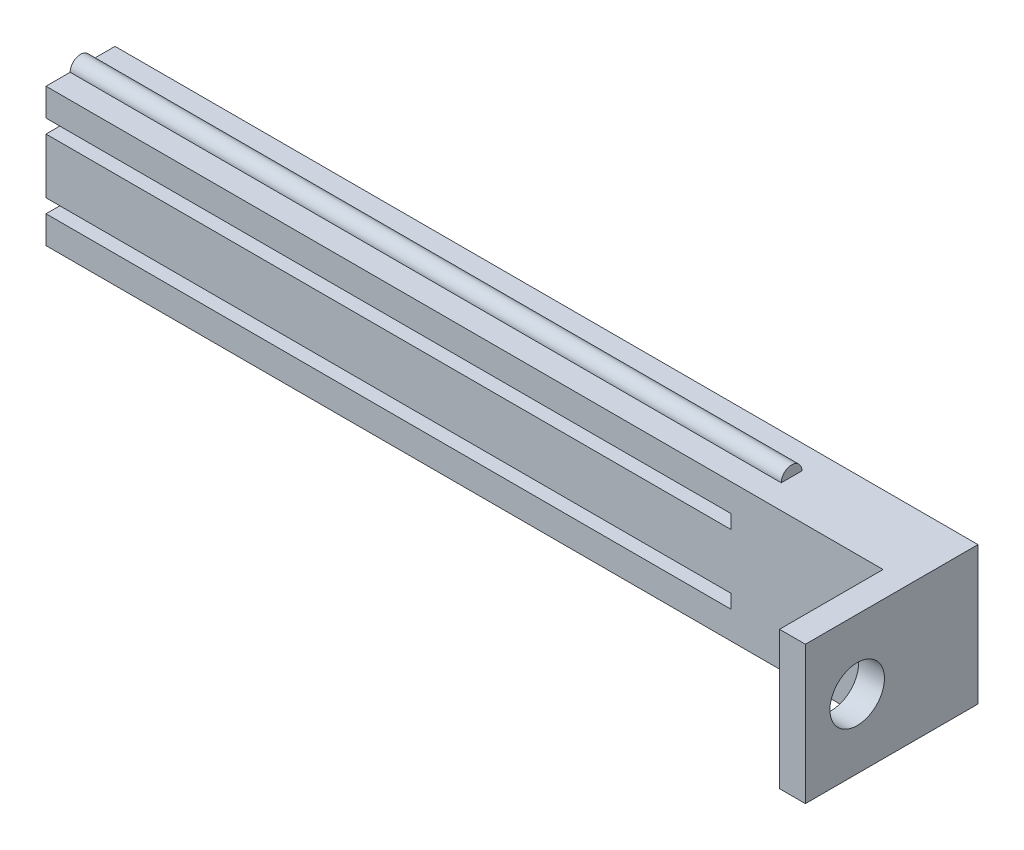
ISO-10303-21;
HEADER;
FILE_DESCRIPTION(('STEP AP214'),'2;1');
FILE_NAME('part.step','',(''),(''),'','','');
FILE_SCHEMA(('AUTOMOTIVE_DESIGN { 1 0 10303 214 1 1 1 1 }'));
ENDSEC;
DATA;
#1=APPLICATION_CONTEXT('core data for automotive mechanical design processes');
#2=APPLICATION_PROTOCOL_DEFINITION('international standard','automotive_design',2000,#1);
#3=PRODUCT_CONTEXT('',#1,'mechanical');
#4=PRODUCT('Part','Part','',(#3));
#5=PRODUCT_RELATED_PRODUCT_CATEGORY('part','',(#4));
#6=PRODUCT_DEFINITION_FORMATION('','',#4);
#7=PRODUCT_DEFINITION_CONTEXT('part definition',#1,'design');
#8=PRODUCT_DEFINITION('design','',#6,#7);
#9=PRODUCT_DEFINITION_SHAPE('','',#8);
#10=(LENGTH_UNIT() NAMED_UNIT(*) SI_UNIT(.MILLI.,.METRE.));
#11=(NAMED_UNIT(*) PLANE_ANGLE_UNIT() SI_UNIT($,.RADIAN.));
#12=(NAMED_UNIT(*) SI_UNIT($,.STERADIAN.) SOLID_ANGLE_UNIT());
#13=UNCERTAINTY_MEASURE_WITH_UNIT(LENGTH_MEASURE(1.E-05),#10,'distance_accuracy_value','');
#14=(GEOMETRIC_REPRESENTATION_CONTEXT(3) GLOBAL_UNCERTAINTY_ASSIGNED_CONTEXT((#13)) GLOBAL_UNIT_ASSIGNED_CONTEXT((#10,
#11,#12)) REPRESENTATION_CONTEXT('',''));
#15=CARTESIAN_POINT('',(0.,0.,0.));
#16=DIRECTION('',(0.,0.,1.));
#17=DIRECTION('',(1.,0.,0.));
#18=AXIS2_PLACEMENT_3D('',#15,#16,#17);
#19=CARTESIAN_POINT('',(-147.278734849391,68.6666666666667,20.));
#20=DIRECTION('',(1.,0.,0.));
#21=DIRECTION('',(0.,0.,-1.));
#22=AXIS2_PLACEMENT_3D('',#19,#20,#21);
#23=PLANE('',#22);
#24=DIRECTION('',(0.,-1.,0.));
#25=VECTOR('',#24,1.);
#26=CARTESIAN_POINT('',(-147.278734849391,0.,15.));
#27=LINE('',#26,#25);
#28=CARTESIAN_POINT('',(-147.278734849391,63.6666666666666,15.));
#29=VERTEX_POINT('',#28);
#30=CARTESIAN_POINT('',(-147.278734849391,60.6666666666666,15.));
#31=VERTEX_POINT('',#30);
#32=EDGE_CURVE('E241',#29,#31,#27,.T.);
#33=ORIENTED_EDGE('',*,*,#32,.T.);
#34=DIRECTION('',(0.,0.,-1.));
#35=VECTOR('',#34,1.);
#36=CARTESIAN_POINT('',(-147.278734849391,60.6666666666666,0.));
#37=LINE('',#36,#35);
#38=CARTESIAN_POINT('',(-147.278734849391,60.6666666666666,20.));
#39=VERTEX_POINT('',#38);
#40=EDGE_CURVE('E250',#39,#31,#37,.T.);
#41=ORIENTED_EDGE('',*,*,#40,.F.);
#42=DIRECTION('',(0.,-1.,0.));
#43=VECTOR('',#42,1.);
#44=CARTESIAN_POINT('',(-147.278734849391,68.6666666666667,20.));
#45=LINE('',#44,#43);
#46=CARTESIAN_POINT('',(-147.278734849391,68.6666666666667,20.));
#47=VERTEX_POINT('',#46);
#48=EDGE_CURVE('E463',#47,#39,#45,.T.);
#49=ORIENTED_EDGE('',*,*,#48,.F.);
#50=DIRECTION('',(0.,0.,-1.));
#51=VECTOR('',#50,1.);
#52=CARTESIAN_POINT('',(-147.278734849391,68.6666666666667,20.));
#53=LINE('',#52,#51);
#54=CARTESIAN_POINT('',(-147.278734849391,68.6666666666666,13.));
#55=VERTEX_POINT('',#54);
#56=EDGE_CURVE('E489',#47,#55,#53,.T.);
#57=ORIENTED_EDGE('',*,*,#56,.T.);
#58=CARTESIAN_POINT('',(-147.278734849391,68.6666666666666,10.));
#59=DIRECTION('',(-1.,0.,0.));
#60=DIRECTION('',(0.,-1.,0.));
#61=AXIS2_PLACEMENT_3D('',#58,#59,#60);
#62=CIRCLE('',#61,3.);
#63=CARTESIAN_POINT('',(-147.278734849391,68.6666666666667,7.));
#64=VERTEX_POINT('',#63);
#65=EDGE_CURVE('E408',#55,#64,#62,.T.);
#66=ORIENTED_EDGE('',*,*,#65,.T.);
#67=CARTESIAN_POINT('',(-147.278734849391,68.6666666666667,0.));
#68=VERTEX_POINT('',#67);
#69=EDGE_CURVE('E475',#64,#68,#53,.T.);
#70=ORIENTED_EDGE('',*,*,#69,.T.);
#71=DIRECTION('',(0.,-1.,0.));
#72=VECTOR('',#71,1.);
#73=CARTESIAN_POINT('',(-147.278734849391,68.6666666666667,0.));
#74=LINE('',#73,#72);
#75=CARTESIAN_POINT('',(-147.278734849391,28.6666666666667,0.));
#76=VERTEX_POINT('',#75);
#77=EDGE_CURVE('E462',#68,#76,#74,.T.);
#78=ORIENTED_EDGE('',*,*,#77,.T.);
#79=DIRECTION('',(0.,0.,-1.));
#80=VECTOR('',#79,1.);
#81=CARTESIAN_POINT('',(-147.278734849391,28.6666666666667,20.));
#82=LINE('',#81,#80);
#83=CARTESIAN_POINT('',(-147.278734849391,28.6666666666666,7.));
#84=VERTEX_POINT('',#83);
#85=EDGE_CURVE('E59',#84,#76,#82,.T.);
#86=ORIENTED_EDGE('',*,*,#85,.F.);
#87=CARTESIAN_POINT('',(-147.278734849391,28.6666666666666,10.));
#88=DIRECTION('',(-1.,0.,0.));
#89=DIRECTION('',(0.,-1.,0.));
#90=AXIS2_PLACEMENT_3D('',#87,#88,#89);
#91=CIRCLE('',#90,3.);
#92=CARTESIAN_POINT('',(-147.278734849391,28.6666666666667,13.));
#93=VERTEX_POINT('',#92);
#94=EDGE_CURVE('E411',#84,#93,#91,.T.);
#95=ORIENTED_EDGE('',*,*,#94,.T.);
#96=CARTESIAN_POINT('',(-147.278734849391,28.6666666666667,20.));
#97=VERTEX_POINT('',#96);
#98=EDGE_CURVE('E11',#97,#93,#82,.T.);
#99=ORIENTED_EDGE('',*,*,#98,.F.);
#100=CARTESIAN_POINT('',(-147.278734849391,36.6666666666666,20.));
#101=VERTEX_POINT('',#100);
#102=EDGE_CURVE('E469',#101,#97,#45,.T.);
#103=ORIENTED_EDGE('',*,*,#102,.F.);
#104=DIRECTION('',(0.,0.,-1.));
#105=VECTOR('',#104,1.);
#106=CARTESIAN_POINT('',(-147.278734849391,36.6666666666666,0.));
#107=LINE('',#106,#105);
#108=CARTESIAN_POINT('',(-147.278734849391,36.6666666666666,15.));
#109=VERTEX_POINT('',#108);
#110=EDGE_CURVE('E353',#101,#109,#107,.T.);
#111=ORIENTED_EDGE('',*,*,#110,.T.);
#112=DIRECTION('',(0.,-1.,0.));
#113=VECTOR('',#112,1.);
#114=CARTESIAN_POINT('',(-147.278734849391,0.,15.));
#115=LINE('',#114,#113);
#116=CARTESIAN_POINT('',(-147.278734849391,33.6666666666666,15.));
#117=VERTEX_POINT('',#116);
#118=EDGE_CURVE('E349',#109,#117,#115,.T.);
#119=ORIENTED_EDGE('',*,*,#118,.T.);
#120=DIRECTION('',(0.,0.,1.));
#121=VECTOR('',#120,1.);
#122=CARTESIAN_POINT('',(-147.278734849391,33.6666666666666,0.));
#123=LINE('',#122,#121);
#124=CARTESIAN_POINT('',(-147.278734849391,33.6666666666666,10.));
#125=VERTEX_POINT('',#124);
#126=EDGE_CURVE('E324',#125,#117,#123,.T.);
#127=ORIENTED_EDGE('',*,*,#126,.F.);
#128=DIRECTION('',(0.,-1.,0.));
#129=VECTOR('',#128,1.);
#130=CARTESIAN_POINT('',(-147.278734849391,0.,10.));
#131=LINE('',#130,#129);
#132=CARTESIAN_POINT('',(-147.278734849391,43.6666666666666,10.));
#133=VERTEX_POINT('',#132);
#134=EDGE_CURVE('E370',#133,#125,#131,.T.);
#135=ORIENTED_EDGE('',*,*,#134,.F.);
#136=DIRECTION('',(0.,0.,1.));
#137=VECTOR('',#136,1.);
#138=CARTESIAN_POINT('',(-147.278734849391,43.6666666666666,0.));
#139=LINE('',#138,#137);
#140=CARTESIAN_POINT('',(-147.278734849391,43.6666666666666,15.));
#141=VERTEX_POINT('',#140);
#142=EDGE_CURVE('E366',#133,#141,#139,.T.);
#143=ORIENTED_EDGE('',*,*,#142,.T.);
#144=DIRECTION('',(0.,-1.,0.));
#145=VECTOR('',#144,1.);
#146=CARTESIAN_POINT('',(-147.278734849391,0.,15.));
#147=LINE('',#146,#145);
#148=CARTESIAN_POINT('',(-147.278734849391,40.6666666666666,15.));
#149=VERTEX_POINT('',#148);
#150=EDGE_CURVE('E362',#141,#149,#147,.T.);
#151=ORIENTED_EDGE('',*,*,#150,.T.);
#152=DIRECTION('',(0.,0.,-1.));
#153=VECTOR('',#152,1.);
#154=CARTESIAN_POINT('',(-147.278734849391,40.6666666666666,0.));
#155=LINE('',#154,#153);
#156=CARTESIAN_POINT('',(-147.278734849391,40.6666666666666,20.));
#157=VERTEX_POINT('',#156);
#158=EDGE_CURVE('E358',#157,#149,#155,.T.);
#159=ORIENTED_EDGE('',*,*,#158,.F.);
#160=CARTESIAN_POINT('',(-147.278734849391,56.6666666666666,20.));
#161=VERTEX_POINT('',#160);
#162=EDGE_CURVE('E468',#161,#157,#45,.T.);
#163=ORIENTED_EDGE('',*,*,#162,.F.);
#164=DIRECTION('',(0.,0.,-1.));
#165=VECTOR('',#164,1.);
#166=CARTESIAN_POINT('',(-147.278734849391,56.6666666666666,0.));
#167=LINE('',#166,#165);
#168=CARTESIAN_POINT('',(-147.278734849391,56.6666666666666,15.));
#169=VERTEX_POINT('',#168);
#170=EDGE_CURVE('E256',#161,#169,#167,.T.);
#171=ORIENTED_EDGE('',*,*,#170,.T.);
#172=DIRECTION('',(0.,-1.,0.));
#173=VECTOR('',#172,1.);
#174=CARTESIAN_POINT('',(-147.278734849391,0.,15.));
#175=LINE('',#174,#173);
#176=CARTESIAN_POINT('',(-147.278734849391,53.6666666666666,15.));
#177=VERTEX_POINT('',#176);
#178=EDGE_CURVE('E292',#169,#177,#175,.T.);
#179=ORIENTED_EDGE('',*,*,#178,.T.);
#180=DIRECTION('',(0.,0.,1.));
#181=VECTOR('',#180,1.);
#182=CARTESIAN_POINT('',(-147.278734849391,53.6666666666666,0.));
#183=LINE('',#182,#181);
#184=CARTESIAN_POINT('',(-147.278734849391,53.6666666666666,10.));
#185=VERTEX_POINT('',#184);
#186=EDGE_CURVE('E288',#185,#177,#183,.T.);
#187=ORIENTED_EDGE('',*,*,#186,.F.);
#188=DIRECTION('',(0.,-1.,0.));
#189=VECTOR('',#188,1.);
#190=CARTESIAN_POINT('',(-147.278734849391,0.,10.));
#191=LINE('',#190,#189);
#192=CARTESIAN_POINT('',(-147.278734849391,63.6666666666666,10.));
#193=VERTEX_POINT('',#192);
#194=EDGE_CURVE('E284',#193,#185,#191,.T.);
#195=ORIENTED_EDGE('',*,*,#194,.F.);
#196=DIRECTION('',(0.,0.,1.));
#197=VECTOR('',#196,1.);
#198=CARTESIAN_POINT('',(-147.278734849391,63.6666666666666,0.));
#199=LINE('',#198,#197);
#200=EDGE_CURVE('E280',#193,#29,#199,.T.);
#201=ORIENTED_EDGE('',*,*,#200,.T.);
#202=EDGE_LOOP('',(#33,#41,#49,#57,#66,#70,#78,#86,#95,#99,#103,#111,#119,#127,#135,#143,#151,
#159,#163,#171,#179,#187,#195,#201));
#203=FACE_BOUND('',#202,.T.);
#204=ADVANCED_FACE('F51',(#203),#23,.F.);
#205=CARTESIAN_POINT('',(-147.278734849391,28.6666666666667,20.));
#206=DIRECTION('',(0.,1.,0.));
#207=DIRECTION('',(0.,0.,1.));
#208=AXIS2_PLACEMENT_3D('',#205,#206,#207);
#209=PLANE('',#208);
#210=DIRECTION('',(0.,0.,-1.));
#211=VECTOR('',#210,1.);
#212=CARTESIAN_POINT('',(58.7212651506094,28.6666666666665,7.));
#213=LINE('',#212,#211);
#214=CARTESIAN_POINT('',(58.7212651506094,28.6666666666667,13.));
#215=VERTEX_POINT('',#214);
#216=CARTESIAN_POINT('',(58.7212651506094,28.6666666666667,7.));
#217=VERTEX_POINT('',#216);
#218=EDGE_CURVE('E422',#215,#217,#213,.T.);
#219=ORIENTED_EDGE('',*,*,#218,.T.);
#220=DIRECTION('',(-1.,0.,0.));
#221=VECTOR('',#220,1.);
#222=CARTESIAN_POINT('',(58.7212651506094,28.6666666666665,7.));
#223=LINE('',#222,#221);
#224=EDGE_CURVE('E429',#217,#84,#223,.T.);
#225=ORIENTED_EDGE('',*,*,#224,.T.);
#226=ORIENTED_EDGE('',*,*,#85,.T.);
#227=DIRECTION('',(1.,0.,0.));
#228=VECTOR('',#227,1.);
#229=CARTESIAN_POINT('',(-147.278734849391,28.6666666666667,0.));
#230=LINE('',#229,#228);
#231=CARTESIAN_POINT('',(102.721265150609,28.6666666666667,0.));
#232=VERTEX_POINT('',#231);
#233=EDGE_CURVE('E479',#76,#232,#230,.T.);
#234=ORIENTED_EDGE('',*,*,#233,.T.);
#235=DIRECTION('',(0.,0.,-1.));
#236=VECTOR('',#235,1.);
#237=CARTESIAN_POINT('',(102.721265150609,28.6666666666667,20.));
#238=LINE('',#237,#236);
#239=CARTESIAN_POINT('',(102.721265150609,28.6666666666667,50.));
#240=VERTEX_POINT('',#239);
#241=EDGE_CURVE('E495',#240,#232,#238,.T.);
#242=ORIENTED_EDGE('',*,*,#241,.F.);
#243=DIRECTION('',(1.,0.,0.));
#244=VECTOR('',#243,1.);
#245=CARTESIAN_POINT('',(102.721265150609,28.6666666666667,50.));
#246=LINE('',#245,#244);
#247=CARTESIAN_POINT('',(95.2212651506094,28.6666666666667,50.));
#248=VERTEX_POINT('',#247);
#249=EDGE_CURVE('E447',#248,#240,#246,.T.);
#250=ORIENTED_EDGE('',*,*,#249,.F.);
#251=DIRECTION('',(0.,0.,-1.));
#252=VECTOR('',#251,1.);
#253=CARTESIAN_POINT('',(95.2212651506094,28.6666666666667,50.));
#254=LINE('',#253,#252);
#255=CARTESIAN_POINT('',(95.2212651506094,28.6666666666667,20.));
#256=VERTEX_POINT('',#255);
#257=EDGE_CURVE('E451',#248,#256,#254,.T.);
#258=ORIENTED_EDGE('',*,*,#257,.T.);
#259=DIRECTION('',(1.,0.,0.));
#260=VECTOR('',#259,1.);
#261=CARTESIAN_POINT('',(-147.278734849391,28.6666666666667,20.));
#262=LINE('',#261,#260);
#263=EDGE_CURVE('E467',#97,#256,#262,.T.);
#264=ORIENTED_EDGE('',*,*,#263,.F.);
#265=ORIENTED_EDGE('',*,*,#98,.T.);
#266=DIRECTION('',(-1.,0.,0.));
#267=VECTOR('',#266,1.);
#268=CARTESIAN_POINT('',(58.7212651506094,28.6666666666665,13.));
#269=LINE('',#268,#267);
#270=EDGE_CURVE('E425',#215,#93,#269,.T.);
#271=ORIENTED_EDGE('',*,*,#270,.F.);
#272=EDGE_LOOP('',(#219,#225,#226,#234,#242,#250,#258,#264,#265,#271));
#273=FACE_BOUND('',#272,.T.);
#274=ADVANCED_FACE('F506',(#273),#209,.F.);
#275=CARTESIAN_POINT('',(102.721265150609,68.6666666666667,20.));
#276=DIRECTION('',(-1.,0.,0.));
#277=DIRECTION('',(0.,-1.,0.));
#278=AXIS2_PLACEMENT_3D('',#275,#276,#277);
#279=PLANE('',#278);
#280=CARTESIAN_POINT('',(102.721265150609,48.6666666666666,35.));
#281=DIRECTION('',(-1.,0.,0.));
#282=DIRECTION('',(0.,-1.,0.));
#283=AXIS2_PLACEMENT_3D('',#280,#281,#282);
#284=CIRCLE('',#283,7.9);
#285=CARTESIAN_POINT('',(102.721265150609,40.7666666666666,35.));
#286=VERTEX_POINT('',#285);
#287=EDGE_CURVE('E354',#286,#286,#284,.T.);
#288=ORIENTED_EDGE('',*,*,#287,.T.);
#289=EDGE_LOOP('',(#288));
#290=FACE_BOUND('',#289,.T.);
#291=DIRECTION('',(0.,1.,0.));
#292=VECTOR('',#291,1.);
#293=CARTESIAN_POINT('',(102.721265150609,68.6666666666667,0.));
#294=LINE('',#293,#292);
#295=CARTESIAN_POINT('',(102.721265150609,68.6666666666667,0.));
#296=VERTEX_POINT('',#295);
#297=EDGE_CURVE('E482',#232,#296,#294,.T.);
#298=ORIENTED_EDGE('',*,*,#297,.T.);
#299=DIRECTION('',(0.,0.,-1.));
#300=VECTOR('',#299,1.);
#301=CARTESIAN_POINT('',(102.721265150609,68.6666666666667,20.));
#302=LINE('',#301,#300);
#303=CARTESIAN_POINT('',(102.721265150609,68.6666666666667,50.));
#304=VERTEX_POINT('',#303);
#305=EDGE_CURVE('E492',#304,#296,#302,.T.);
#306=ORIENTED_EDGE('',*,*,#305,.F.);
#307=DIRECTION('',(0.,1.,0.));
#308=VECTOR('',#307,1.);
#309=CARTESIAN_POINT('',(102.721265150609,68.6666666666667,50.));
#310=LINE('',#309,#308);
#311=EDGE_CURVE('E437',#240,#304,#310,.T.);
#312=ORIENTED_EDGE('',*,*,#311,.F.);
#313=ORIENTED_EDGE('',*,*,#241,.T.);
#314=EDGE_LOOP('',(#298,#306,#312,#313));
#315=FACE_BOUND('',#314,.T.);
#316=ADVANCED_FACE('F521',(#290,#315),#279,.F.);
#317=CARTESIAN_POINT('',(-147.278734849391,68.6666666666667,20.));
#318=DIRECTION('',(0.,-1.,0.));
#319=DIRECTION('',(0.,0.,-1.));
#320=AXIS2_PLACEMENT_3D('',#317,#318,#319);
#321=PLANE('',#320);
#322=DIRECTION('',(0.,0.,1.));
#323=VECTOR('',#322,1.);
#324=CARTESIAN_POINT('',(58.7212651506094,68.6666666666665,7.));
#325=LINE('',#324,#323);
#326=CARTESIAN_POINT('',(58.7212651506094,68.6666666666665,7.));
#327=VERTEX_POINT('',#326);
#328=CARTESIAN_POINT('',(58.7212651506094,68.6666666666665,13.));
#329=VERTEX_POINT('',#328);
#330=EDGE_CURVE('E404',#327,#329,#325,.T.);
#331=ORIENTED_EDGE('',*,*,#330,.T.);
#332=DIRECTION('',(-1.,0.,0.));
#333=VECTOR('',#332,1.);
#334=CARTESIAN_POINT('',(58.7212651506094,68.6666666666665,13.));
#335=LINE('',#334,#333);
#336=EDGE_CURVE('E302',#329,#55,#335,.T.);
#337=ORIENTED_EDGE('',*,*,#336,.T.);
#338=ORIENTED_EDGE('',*,*,#56,.F.);
#339=DIRECTION('',(-1.,0.,0.));
#340=VECTOR('',#339,1.);
#341=CARTESIAN_POINT('',(-147.278734849391,68.6666666666667,20.));
#342=LINE('',#341,#340);
#343=CARTESIAN_POINT('',(95.2212651506094,68.6666666666667,20.));
#344=VERTEX_POINT('',#343);
#345=EDGE_CURVE('E472',#344,#47,#342,.T.);
#346=ORIENTED_EDGE('',*,*,#345,.F.);
#347=DIRECTION('',(0.,0.,-1.));
#348=VECTOR('',#347,1.);
#349=CARTESIAN_POINT('',(95.2212651506094,68.6666666666667,50.));
#350=LINE('',#349,#348);
#351=CARTESIAN_POINT('',(95.2212651506094,68.6666666666667,50.));
#352=VERTEX_POINT('',#351);
#353=EDGE_CURVE('E458',#352,#344,#350,.T.);
#354=ORIENTED_EDGE('',*,*,#353,.F.);
#355=DIRECTION('',(-1.,0.,0.));
#356=VECTOR('',#355,1.);
#357=CARTESIAN_POINT('',(102.721265150609,68.6666666666667,50.));
#358=LINE('',#357,#356);
#359=EDGE_CURVE('E441',#304,#352,#358,.T.);
#360=ORIENTED_EDGE('',*,*,#359,.F.);
#361=ORIENTED_EDGE('',*,*,#305,.T.);
#362=DIRECTION('',(-1.,0.,0.));
#363=VECTOR('',#362,1.);
#364=CARTESIAN_POINT('',(-147.278734849391,68.6666666666667,0.));
#365=LINE('',#364,#363);
#366=EDGE_CURVE('E485',#296,#68,#365,.T.);
#367=ORIENTED_EDGE('',*,*,#366,.T.);
#368=ORIENTED_EDGE('',*,*,#69,.F.);
#369=DIRECTION('',(-1.,0.,0.));
#370=VECTOR('',#369,1.);
#371=CARTESIAN_POINT('',(58.7212651506094,68.6666666666665,7.));
#372=LINE('',#371,#370);
#373=EDGE_CURVE('E400',#327,#64,#372,.T.);
#374=ORIENTED_EDGE('',*,*,#373,.F.);
#375=EDGE_LOOP('',(#331,#337,#338,#346,#354,#360,#361,#367,#368,#374));
#376=FACE_BOUND('',#375,.T.);
#377=ADVANCED_FACE('F518',(#376),#321,.F.);
#378=CARTESIAN_POINT('',(0.,0.,20.));
#379=DIRECTION('',(0.,0.,1.));
#380=DIRECTION('',(1.,0.,0.));
#381=AXIS2_PLACEMENT_3D('',#378,#379,#380);
#382=PLANE('',#381);
#383=DIRECTION('',(-1.,0.,0.));
#384=VECTOR('',#383,1.);
#385=CARTESIAN_POINT('',(51.2212651506094,60.6666666666665,20.));
#386=LINE('',#385,#384);
#387=CARTESIAN_POINT('',(51.2212651506094,60.6666666666665,20.));
#388=VERTEX_POINT('',#387);
#389=EDGE_CURVE('E303',#388,#39,#386,.T.);
#390=ORIENTED_EDGE('',*,*,#389,.F.);
#391=DIRECTION('',(0.,1.,0.));
#392=VECTOR('',#391,1.);
#393=CARTESIAN_POINT('',(51.2212651506094,0.,20.));
#394=LINE('',#393,#392);
#395=CARTESIAN_POINT('',(51.2212651506094,56.6666666666665,20.));
#396=VERTEX_POINT('',#395);
#397=EDGE_CURVE('E273',#396,#388,#394,.T.);
#398=ORIENTED_EDGE('',*,*,#397,.F.);
#399=DIRECTION('',(-1.,0.,0.));
#400=VECTOR('',#399,1.);
#401=CARTESIAN_POINT('',(51.2212651506094,56.6666666666665,20.));
#402=LINE('',#401,#400);
#403=EDGE_CURVE('E306',#396,#161,#402,.T.);
#404=ORIENTED_EDGE('',*,*,#403,.T.);
#405=ORIENTED_EDGE('',*,*,#162,.T.);
#406=DIRECTION('',(-1.,0.,0.));
#407=VECTOR('',#406,1.);
#408=CARTESIAN_POINT('',(51.2212651506094,40.6666666666665,20.));
#409=LINE('',#408,#407);
#410=CARTESIAN_POINT('',(51.2212651506094,40.6666666666665,20.));
#411=VERTEX_POINT('',#410);
#412=EDGE_CURVE('E391',#411,#157,#409,.T.);
#413=ORIENTED_EDGE('',*,*,#412,.F.);
#414=DIRECTION('',(0.,1.,0.));
#415=VECTOR('',#414,1.);
#416=CARTESIAN_POINT('',(51.2212651506094,0.,20.));
#417=LINE('',#416,#415);
#418=CARTESIAN_POINT('',(51.2212651506094,36.6666666666665,20.));
#419=VERTEX_POINT('',#418);
#420=EDGE_CURVE('E327',#419,#411,#417,.T.);
#421=ORIENTED_EDGE('',*,*,#420,.F.);
#422=DIRECTION('',(-1.,0.,0.));
#423=VECTOR('',#422,1.);
#424=CARTESIAN_POINT('',(51.2212651506094,36.6666666666665,20.));
#425=LINE('',#424,#423);
#426=EDGE_CURVE('E394',#419,#101,#425,.T.);
#427=ORIENTED_EDGE('',*,*,#426,.T.);
#428=ORIENTED_EDGE('',*,*,#102,.T.);
#429=ORIENTED_EDGE('',*,*,#263,.T.);
#430=DIRECTION('',(0.,-1.,0.));
#431=VECTOR('',#430,1.);
#432=CARTESIAN_POINT('',(95.2212651506094,68.6666666666667,20.));
#433=LINE('',#432,#431);
#434=EDGE_CURVE('E433',#344,#256,#433,.T.);
#435=ORIENTED_EDGE('',*,*,#434,.F.);
#436=ORIENTED_EDGE('',*,*,#345,.T.);
#437=ORIENTED_EDGE('',*,*,#48,.T.);
#438=EDGE_LOOP('',(#390,#398,#404,#405,#413,#421,#427,#428,#429,#435,#436,#437));
#439=FACE_BOUND('',#438,.T.);
#440=ADVANCED_FACE('F534',(#439),#382,.T.);
#441=CARTESIAN_POINT('',(0.,0.,0.));
#442=DIRECTION('',(0.,0.,1.));
#443=DIRECTION('',(1.,0.,0.));
#444=AXIS2_PLACEMENT_3D('',#441,#442,#443);
#445=PLANE('',#444);
#446=ORIENTED_EDGE('',*,*,#77,.F.);
#447=ORIENTED_EDGE('',*,*,#366,.F.);
#448=ORIENTED_EDGE('',*,*,#297,.F.);
#449=ORIENTED_EDGE('',*,*,#233,.F.);
#450=EDGE_LOOP('',(#446,#447,#448,#449));
#451=FACE_BOUND('',#450,.T.);
#452=ADVANCED_FACE('F512',(#451),#445,.F.);
#453=CARTESIAN_POINT('',(95.2212651506094,68.6666666666667,50.));
#454=DIRECTION('',(1.,0.,0.));
#455=DIRECTION('',(0.,0.,-1.));
#456=AXIS2_PLACEMENT_3D('',#453,#454,#455);
#457=PLANE('',#456);
#458=CARTESIAN_POINT('',(95.2212651506094,48.6666666666666,35.));
#459=DIRECTION('',(-1.,0.,0.));
#460=DIRECTION('',(0.,-1.,0.));
#461=AXIS2_PLACEMENT_3D('',#458,#459,#460);
#462=CIRCLE('',#461,7.9);
#463=CARTESIAN_POINT('',(95.2212651506094,40.7666666666666,35.));
#464=VERTEX_POINT('',#463);
#465=EDGE_CURVE('E259',#464,#464,#462,.T.);
#466=ORIENTED_EDGE('',*,*,#465,.F.);
#467=EDGE_LOOP('',(#466));
#468=FACE_BOUND('',#467,.T.);
#469=ORIENTED_EDGE('',*,*,#434,.T.);
#470=ORIENTED_EDGE('',*,*,#257,.F.);
#471=DIRECTION('',(0.,-1.,0.));
#472=VECTOR('',#471,1.);
#473=CARTESIAN_POINT('',(95.2212651506094,68.6666666666667,50.));
#474=LINE('',#473,#472);
#475=EDGE_CURVE('E444',#352,#248,#474,.T.);
#476=ORIENTED_EDGE('',*,*,#475,.F.);
#477=ORIENTED_EDGE('',*,*,#353,.T.);
#478=EDGE_LOOP('',(#469,#470,#476,#477));
#479=FACE_BOUND('',#478,.T.);
#480=ADVANCED_FACE('F530',(#468,#479),#457,.F.);
#481=CARTESIAN_POINT('',(0.,0.,50.));
#482=DIRECTION('',(0.,0.,-1.));
#483=DIRECTION('',(-1.,0.,0.));
#484=AXIS2_PLACEMENT_3D('',#481,#482,#483);
#485=PLANE('',#484);
#486=ORIENTED_EDGE('',*,*,#311,.T.);
#487=ORIENTED_EDGE('',*,*,#359,.T.);
#488=ORIENTED_EDGE('',*,*,#475,.T.);
#489=ORIENTED_EDGE('',*,*,#249,.T.);
#490=EDGE_LOOP('',(#486,#487,#488,#489));
#491=FACE_BOUND('',#490,.T.);
#492=ADVANCED_FACE('F523',(#491),#485,.F.);
#493=CARTESIAN_POINT('',(58.7212651506094,28.6666666666665,10.));
#494=DIRECTION('',(-1.,0.,0.));
#495=DIRECTION('',(0.,-1.,0.));
#496=AXIS2_PLACEMENT_3D('',#493,#494,#495);
#497=CYLINDRICAL_SURFACE('',#496,3.);
#498=ORIENTED_EDGE('',*,*,#94,.F.);
#499=ORIENTED_EDGE('',*,*,#224,.F.);
#500=CARTESIAN_POINT('',(58.7212651506094,28.6666666666665,10.));
#501=DIRECTION('',(-1.,0.,0.));
#502=DIRECTION('',(0.,-1.,0.));
#503=AXIS2_PLACEMENT_3D('',#500,#501,#502);
#504=CIRCLE('',#503,3.);
#505=EDGE_CURVE('E418',#217,#215,#504,.T.);
#506=ORIENTED_EDGE('',*,*,#505,.T.);
#507=ORIENTED_EDGE('',*,*,#270,.T.);
#508=EDGE_LOOP('',(#498,#499,#506,#507));
#509=FACE_BOUND('',#508,.T.);
#510=ADVANCED_FACE('F566',(#509),#497,.T.);
#511=CARTESIAN_POINT('',(58.7212651506094,28.6666666666665,10.));
#512=DIRECTION('',(-1.,0.,0.));
#513=DIRECTION('',(0.,-1.,0.));
#514=AXIS2_PLACEMENT_3D('',#511,#512,#513);
#515=PLANE('',#514);
#516=ORIENTED_EDGE('',*,*,#505,.F.);
#517=ORIENTED_EDGE('',*,*,#218,.F.);
#518=EDGE_LOOP('',(#516,#517));
#519=FACE_BOUND('',#518,.T.);
#520=ADVANCED_FACE('F570',(#519),#515,.F.);
#521=CARTESIAN_POINT('',(58.7212651506094,68.6666666666665,10.));
#522=DIRECTION('',(-1.,0.,0.));
#523=DIRECTION('',(0.,-1.,0.));
#524=AXIS2_PLACEMENT_3D('',#521,#522,#523);
#525=CYLINDRICAL_SURFACE('',#524,3.);
#526=ORIENTED_EDGE('',*,*,#65,.F.);
#527=ORIENTED_EDGE('',*,*,#336,.F.);
#528=CARTESIAN_POINT('',(58.7212651506094,68.6666666666665,10.));
#529=DIRECTION('',(-1.,0.,0.));
#530=DIRECTION('',(0.,-1.,0.));
#531=AXIS2_PLACEMENT_3D('',#528,#529,#530);
#532=CIRCLE('',#531,3.);
#533=EDGE_CURVE('E412',#329,#327,#532,.T.);
#534=ORIENTED_EDGE('',*,*,#533,.T.);
#535=ORIENTED_EDGE('',*,*,#373,.T.);
#536=EDGE_LOOP('',(#526,#527,#534,#535));
#537=FACE_BOUND('',#536,.T.);
#538=ADVANCED_FACE('F572',(#537),#525,.T.);
#539=CARTESIAN_POINT('',(58.7212651506094,68.6666666666665,10.));
#540=DIRECTION('',(-1.,0.,0.));
#541=DIRECTION('',(0.,-1.,0.));
#542=AXIS2_PLACEMENT_3D('',#539,#540,#541);
#543=PLANE('',#542);
#544=ORIENTED_EDGE('',*,*,#533,.F.);
#545=ORIENTED_EDGE('',*,*,#330,.F.);
#546=EDGE_LOOP('',(#544,#545));
#547=FACE_BOUND('',#546,.T.);
#548=ADVANCED_FACE('F578',(#547),#543,.F.);
#549=CARTESIAN_POINT('',(51.2212651506094,0.,15.));
#550=DIRECTION('',(0.,0.,-1.));
#551=DIRECTION('',(-1.,0.,0.));
#552=AXIS2_PLACEMENT_3D('',#549,#550,#551);
#553=PLANE('',#552);
#554=ORIENTED_EDGE('',*,*,#118,.F.);
#555=DIRECTION('',(-1.,0.,0.));
#556=VECTOR('',#555,1.);
#557=CARTESIAN_POINT('',(51.2212651506094,36.6666666666665,15.));
#558=LINE('',#557,#556);
#559=CARTESIAN_POINT('',(51.2212651506094,36.6666666666665,15.));
#560=VERTEX_POINT('',#559);
#561=EDGE_CURVE('E348',#560,#109,#558,.T.);
#562=ORIENTED_EDGE('',*,*,#561,.F.);
#563=DIRECTION('',(0.,-1.,0.));
#564=VECTOR('',#563,1.);
#565=CARTESIAN_POINT('',(51.2212651506094,0.,15.));
#566=LINE('',#565,#564);
#567=CARTESIAN_POINT('',(51.2212651506094,33.6666666666665,15.));
#568=VERTEX_POINT('',#567);
#569=EDGE_CURVE('E321',#560,#568,#566,.T.);
#570=ORIENTED_EDGE('',*,*,#569,.T.);
#571=DIRECTION('',(-1.,0.,0.));
#572=VECTOR('',#571,1.);
#573=CARTESIAN_POINT('',(51.2212651506094,33.6666666666665,15.));
#574=LINE('',#573,#572);
#575=EDGE_CURVE('E281',#568,#117,#574,.T.);
#576=ORIENTED_EDGE('',*,*,#575,.T.);
#577=EDGE_LOOP('',(#554,#562,#570,#576));
#578=FACE_BOUND('',#577,.T.);
#579=ADVANCED_FACE('F627',(#578),#553,.T.);
#580=CARTESIAN_POINT('',(51.2212651506094,33.6666666666665,0.));
#581=DIRECTION('',(0.,-1.,0.));
#582=DIRECTION('',(1.,0.,0.));
#583=AXIS2_PLACEMENT_3D('',#580,#581,#582);
#584=PLANE('',#583);
#585=ORIENTED_EDGE('',*,*,#126,.T.);
#586=ORIENTED_EDGE('',*,*,#575,.F.);
#587=DIRECTION('',(0.,0.,1.));
#588=VECTOR('',#587,1.);
#589=CARTESIAN_POINT('',(51.2212651506094,33.6666666666665,0.));
#590=LINE('',#589,#588);
#591=CARTESIAN_POINT('',(51.2212651506094,33.6666666666665,10.));
#592=VERTEX_POINT('',#591);
#593=EDGE_CURVE('E344',#592,#568,#590,.T.);
#594=ORIENTED_EDGE('',*,*,#593,.F.);
#595=DIRECTION('',(-1.,0.,0.));
#596=VECTOR('',#595,1.);
#597=CARTESIAN_POINT('',(51.2212651506094,33.6666666666665,10.));
#598=LINE('',#597,#596);
#599=EDGE_CURVE('E379',#592,#125,#598,.T.);
#600=ORIENTED_EDGE('',*,*,#599,.T.);
#601=EDGE_LOOP('',(#585,#586,#594,#600));
#602=FACE_BOUND('',#601,.T.);
#603=ADVANCED_FACE('F635',(#602),#584,.F.);
#604=CARTESIAN_POINT('',(51.2212651506094,0.,10.));
#605=DIRECTION('',(0.,0.,-1.));
#606=DIRECTION('',(0.,1.,0.));
#607=AXIS2_PLACEMENT_3D('',#604,#605,#606);
#608=PLANE('',#607);
#609=ORIENTED_EDGE('',*,*,#134,.T.);
#610=ORIENTED_EDGE('',*,*,#599,.F.);
#611=DIRECTION('',(0.,-1.,0.));
#612=VECTOR('',#611,1.);
#613=CARTESIAN_POINT('',(51.2212651506094,0.,10.));
#614=LINE('',#613,#612);
#615=CARTESIAN_POINT('',(51.2212651506094,43.6666666666666,10.));
#616=VERTEX_POINT('',#615);
#617=EDGE_CURVE('E340',#616,#592,#614,.T.);
#618=ORIENTED_EDGE('',*,*,#617,.F.);
#619=DIRECTION('',(-1.,0.,0.));
#620=VECTOR('',#619,1.);
#621=CARTESIAN_POINT('',(51.2212651506094,43.6666666666666,10.));
#622=LINE('',#621,#620);
#623=EDGE_CURVE('E382',#616,#133,#622,.T.);
#624=ORIENTED_EDGE('',*,*,#623,.T.);
#625=EDGE_LOOP('',(#609,#610,#618,#624));
#626=FACE_BOUND('',#625,.T.);
#627=ADVANCED_FACE('F644',(#626),#608,.F.);
#628=CARTESIAN_POINT('',(51.2212651506094,43.6666666666666,0.));
#629=DIRECTION('',(0.,-1.,0.));
#630=DIRECTION('',(1.,0.,0.));
#631=AXIS2_PLACEMENT_3D('',#628,#629,#630);
#632=PLANE('',#631);
#633=ORIENTED_EDGE('',*,*,#142,.F.);
#634=ORIENTED_EDGE('',*,*,#623,.F.);
#635=DIRECTION('',(0.,0.,1.));
#636=VECTOR('',#635,1.);
#637=CARTESIAN_POINT('',(51.2212651506094,43.6666666666666,0.));
#638=LINE('',#637,#636);
#639=CARTESIAN_POINT('',(51.2212651506094,43.6666666666666,15.));
#640=VERTEX_POINT('',#639);
#641=EDGE_CURVE('E337',#616,#640,#638,.T.);
#642=ORIENTED_EDGE('',*,*,#641,.T.);
#643=DIRECTION('',(-1.,0.,0.));
#644=VECTOR('',#643,1.);
#645=CARTESIAN_POINT('',(51.2212651506094,43.6666666666666,15.));
#646=LINE('',#645,#644);
#647=EDGE_CURVE('E385',#640,#141,#646,.T.);
#648=ORIENTED_EDGE('',*,*,#647,.T.);
#649=EDGE_LOOP('',(#633,#634,#642,#648));
#650=FACE_BOUND('',#649,.T.);
#651=ADVANCED_FACE('F653',(#650),#632,.T.);
#652=CARTESIAN_POINT('',(51.2212651506094,0.,15.));
#653=DIRECTION('',(0.,0.,-1.));
#654=DIRECTION('',(-1.,0.,0.));
#655=AXIS2_PLACEMENT_3D('',#652,#653,#654);
#656=PLANE('',#655);
#657=ORIENTED_EDGE('',*,*,#150,.F.);
#658=ORIENTED_EDGE('',*,*,#647,.F.);
#659=DIRECTION('',(0.,-1.,0.));
#660=VECTOR('',#659,1.);
#661=CARTESIAN_POINT('',(51.2212651506094,0.,15.));
#662=LINE('',#661,#660);
#663=CARTESIAN_POINT('',(51.2212651506094,40.6666666666665,15.));
#664=VERTEX_POINT('',#663);
#665=EDGE_CURVE('E334',#640,#664,#662,.T.);
#666=ORIENTED_EDGE('',*,*,#665,.T.);
#667=DIRECTION('',(-1.,0.,0.));
#668=VECTOR('',#667,1.);
#669=CARTESIAN_POINT('',(51.2212651506094,40.6666666666665,15.));
#670=LINE('',#669,#668);
#671=EDGE_CURVE('E388',#664,#149,#670,.T.);
#672=ORIENTED_EDGE('',*,*,#671,.T.);
#673=EDGE_LOOP('',(#657,#658,#666,#672));
#674=FACE_BOUND('',#673,.T.);
#675=ADVANCED_FACE('F662',(#674),#656,.T.);
#676=CARTESIAN_POINT('',(51.2212651506094,40.6666666666665,0.));
#677=DIRECTION('',(0.,1.,0.));
#678=DIRECTION('',(-1.,0.,0.));
#679=AXIS2_PLACEMENT_3D('',#676,#677,#678);
#680=PLANE('',#679);
#681=ORIENTED_EDGE('',*,*,#158,.T.);
#682=ORIENTED_EDGE('',*,*,#671,.F.);
#683=DIRECTION('',(0.,0.,-1.));
#684=VECTOR('',#683,1.);
#685=CARTESIAN_POINT('',(51.2212651506094,40.6666666666665,0.));
#686=LINE('',#685,#684);
#687=EDGE_CURVE('E330',#411,#664,#686,.T.);
#688=ORIENTED_EDGE('',*,*,#687,.F.);
#689=ORIENTED_EDGE('',*,*,#412,.T.);
#690=EDGE_LOOP('',(#681,#682,#688,#689));
#691=FACE_BOUND('',#690,.T.);
#692=ADVANCED_FACE('F671',(#691),#680,.F.);
#693=CARTESIAN_POINT('',(51.2212651506094,36.6666666666665,0.));
#694=DIRECTION('',(0.,1.,0.));
#695=DIRECTION('',(-1.,0.,0.));
#696=AXIS2_PLACEMENT_3D('',#693,#694,#695);
#697=PLANE('',#696);
#698=ORIENTED_EDGE('',*,*,#110,.F.);
#699=ORIENTED_EDGE('',*,*,#426,.F.);
#700=DIRECTION('',(0.,0.,-1.));
#701=VECTOR('',#700,1.);
#702=CARTESIAN_POINT('',(51.2212651506094,36.6666666666665,0.));
#703=LINE('',#702,#701);
#704=EDGE_CURVE('E74',#419,#560,#703,.T.);
#705=ORIENTED_EDGE('',*,*,#704,.T.);
#706=ORIENTED_EDGE('',*,*,#561,.T.);
#707=EDGE_LOOP('',(#698,#699,#705,#706));
#708=FACE_BOUND('',#707,.T.);
#709=ADVANCED_FACE('F680',(#708),#697,.T.);
#710=CARTESIAN_POINT('',(51.2212651506094,0.,0.));
#711=DIRECTION('',(-1.,0.,0.));
#712=DIRECTION('',(0.,0.,1.));
#713=AXIS2_PLACEMENT_3D('',#710,#711,#712);
#714=PLANE('',#713);
#715=ORIENTED_EDGE('',*,*,#569,.F.);
#716=ORIENTED_EDGE('',*,*,#704,.F.);
#717=ORIENTED_EDGE('',*,*,#420,.T.);
#718=ORIENTED_EDGE('',*,*,#687,.T.);
#719=ORIENTED_EDGE('',*,*,#665,.F.);
#720=ORIENTED_EDGE('',*,*,#641,.F.);
#721=ORIENTED_EDGE('',*,*,#617,.T.);
#722=ORIENTED_EDGE('',*,*,#593,.T.);
#723=EDGE_LOOP('',(#715,#716,#717,#718,#719,#720,#721,#722));
#724=FACE_BOUND('',#723,.T.);
#725=ADVANCED_FACE('F689',(#724),#714,.T.);
#726=CARTESIAN_POINT('',(51.2212651506094,0.,15.));
#727=DIRECTION('',(0.,0.,-1.));
#728=DIRECTION('',(-1.,0.,0.));
#729=AXIS2_PLACEMENT_3D('',#726,#727,#728);
#730=PLANE('',#729);
#731=ORIENTED_EDGE('',*,*,#32,.F.);
#732=DIRECTION('',(-1.,0.,0.));
#733=VECTOR('',#732,1.);
#734=CARTESIAN_POINT('',(51.2212651506094,63.6666666666665,15.));
#735=LINE('',#734,#733);
#736=CARTESIAN_POINT('',(51.2212651506094,63.6666666666665,15.));
#737=VERTEX_POINT('',#736);
#738=EDGE_CURVE('E227',#737,#29,#735,.T.);
#739=ORIENTED_EDGE('',*,*,#738,.F.);
#740=DIRECTION('',(0.,-1.,0.));
#741=VECTOR('',#740,1.);
#742=CARTESIAN_POINT('',(51.2212651506094,0.,15.));
#743=LINE('',#742,#741);
#744=CARTESIAN_POINT('',(51.2212651506094,60.6666666666665,15.));
#745=VERTEX_POINT('',#744);
#746=EDGE_CURVE('E235',#737,#745,#743,.T.);
#747=ORIENTED_EDGE('',*,*,#746,.T.);
#748=DIRECTION('',(-1.,0.,0.));
#749=VECTOR('',#748,1.);
#750=CARTESIAN_POINT('',(51.2212651506094,60.6666666666665,15.));
#751=LINE('',#750,#749);
#752=EDGE_CURVE('E299',#745,#31,#751,.T.);
#753=ORIENTED_EDGE('',*,*,#752,.T.);
#754=EDGE_LOOP('',(#731,#739,#747,#753));
#755=FACE_BOUND('',#754,.T.);
#756=ADVANCED_FACE('F238',(#755),#730,.T.);
#757=CARTESIAN_POINT('',(51.2212651506094,60.6666666666665,0.));
#758=DIRECTION('',(0.,1.,0.));
#759=DIRECTION('',(-1.,0.,0.));
#760=AXIS2_PLACEMENT_3D('',#757,#758,#759);
#761=PLANE('',#760);
#762=ORIENTED_EDGE('',*,*,#40,.T.);
#763=ORIENTED_EDGE('',*,*,#752,.F.);
#764=DIRECTION('',(0.,0.,-1.));
#765=VECTOR('',#764,1.);
#766=CARTESIAN_POINT('',(51.2212651506094,60.6666666666665,0.));
#767=LINE('',#766,#765);
#768=EDGE_CURVE('E244',#388,#745,#767,.T.);
#769=ORIENTED_EDGE('',*,*,#768,.F.);
#770=ORIENTED_EDGE('',*,*,#389,.T.);
#771=EDGE_LOOP('',(#762,#763,#769,#770));
#772=FACE_BOUND('',#771,.T.);
#773=ADVANCED_FACE('F540',(#772),#761,.F.);
#774=CARTESIAN_POINT('',(51.2212651506094,56.6666666666665,0.));
#775=DIRECTION('',(0.,1.,0.));
#776=DIRECTION('',(-1.,0.,0.));
#777=AXIS2_PLACEMENT_3D('',#774,#775,#776);
#778=PLANE('',#777);
#779=ORIENTED_EDGE('',*,*,#170,.F.);
#780=ORIENTED_EDGE('',*,*,#403,.F.);
#781=DIRECTION('',(0.,0.,-1.));
#782=VECTOR('',#781,1.);
#783=CARTESIAN_POINT('',(51.2212651506094,56.6666666666665,0.));
#784=LINE('',#783,#782);
#785=CARTESIAN_POINT('',(51.2212651506094,56.6666666666665,15.));
#786=VERTEX_POINT('',#785);
#787=EDGE_CURVE('E66',#396,#786,#784,.T.);
#788=ORIENTED_EDGE('',*,*,#787,.T.);
#789=DIRECTION('',(-1.,0.,0.));
#790=VECTOR('',#789,1.);
#791=CARTESIAN_POINT('',(51.2212651506094,56.6666666666665,15.));
#792=LINE('',#791,#790);
#793=EDGE_CURVE('E310',#786,#169,#792,.T.);
#794=ORIENTED_EDGE('',*,*,#793,.T.);
#795=EDGE_LOOP('',(#779,#780,#788,#794));
#796=FACE_BOUND('',#795,.T.);
#797=ADVANCED_FACE('F554',(#796),#778,.T.);
#798=CARTESIAN_POINT('',(51.2212651506094,0.,15.));
#799=DIRECTION('',(0.,0.,-1.));
#800=DIRECTION('',(-1.,0.,0.));
#801=AXIS2_PLACEMENT_3D('',#798,#799,#800);
#802=PLANE('',#801);
#803=ORIENTED_EDGE('',*,*,#178,.F.);
#804=ORIENTED_EDGE('',*,*,#793,.F.);
#805=DIRECTION('',(0.,-1.,0.));
#806=VECTOR('',#805,1.);
#807=CARTESIAN_POINT('',(51.2212651506094,0.,15.));
#808=LINE('',#807,#806);
#809=CARTESIAN_POINT('',(51.2212651506094,53.6666666666665,15.));
#810=VERTEX_POINT('',#809);
#811=EDGE_CURVE('E268',#786,#810,#808,.T.);
#812=ORIENTED_EDGE('',*,*,#811,.T.);
#813=DIRECTION('',(-1.,0.,0.));
#814=VECTOR('',#813,1.);
#815=CARTESIAN_POINT('',(51.2212651506094,53.6666666666665,15.));
#816=LINE('',#815,#814);
#817=EDGE_CURVE('E313',#810,#177,#816,.T.);
#818=ORIENTED_EDGE('',*,*,#817,.T.);
#819=EDGE_LOOP('',(#803,#804,#812,#818));
#820=FACE_BOUND('',#819,.T.);
#821=ADVANCED_FACE('F551',(#820),#802,.T.);
#822=CARTESIAN_POINT('',(51.2212651506094,53.6666666666665,0.));
#823=DIRECTION('',(0.,-1.,0.));
#824=DIRECTION('',(1.,0.,0.));
#825=AXIS2_PLACEMENT_3D('',#822,#823,#824);
#826=PLANE('',#825);
#827=ORIENTED_EDGE('',*,*,#186,.T.);
#828=ORIENTED_EDGE('',*,*,#817,.F.);
#829=DIRECTION('',(0.,0.,1.));
#830=VECTOR('',#829,1.);
#831=CARTESIAN_POINT('',(51.2212651506094,53.6666666666665,0.));
#832=LINE('',#831,#830);
#833=CARTESIAN_POINT('',(51.2212651506094,53.6666666666665,10.));
#834=VERTEX_POINT('',#833);
#835=EDGE_CURVE('E264',#834,#810,#832,.T.);
#836=ORIENTED_EDGE('',*,*,#835,.F.);
#837=DIRECTION('',(-1.,0.,0.));
#838=VECTOR('',#837,1.);
#839=CARTESIAN_POINT('',(51.2212651506094,53.6666666666665,10.));
#840=LINE('',#839,#838);
#841=EDGE_CURVE('E316',#834,#185,#840,.T.);
#842=ORIENTED_EDGE('',*,*,#841,.T.);
#843=EDGE_LOOP('',(#827,#828,#836,#842));
#844=FACE_BOUND('',#843,.T.);
#845=ADVANCED_FACE('F548',(#844),#826,.F.);
#846=CARTESIAN_POINT('',(51.2212651506094,0.,10.));
#847=DIRECTION('',(0.,0.,-1.));
#848=DIRECTION('',(0.,1.,0.));
#849=AXIS2_PLACEMENT_3D('',#846,#847,#848);
#850=PLANE('',#849);
#851=ORIENTED_EDGE('',*,*,#194,.T.);
#852=ORIENTED_EDGE('',*,*,#841,.F.);
#853=DIRECTION('',(0.,-1.,0.));
#854=VECTOR('',#853,1.);
#855=CARTESIAN_POINT('',(51.2212651506094,0.,10.));
#856=LINE('',#855,#854);
#857=CARTESIAN_POINT('',(51.2212651506094,63.6666666666665,10.));
#858=VERTEX_POINT('',#857);
#859=EDGE_CURVE('E234',#858,#834,#856,.T.);
#860=ORIENTED_EDGE('',*,*,#859,.F.);
#861=DIRECTION('',(-1.,0.,0.));
#862=VECTOR('',#861,1.);
#863=CARTESIAN_POINT('',(51.2212651506094,63.6666666666665,10.));
#864=LINE('',#863,#862);
#865=EDGE_CURVE('E229',#858,#193,#864,.T.);
#866=ORIENTED_EDGE('',*,*,#865,.T.);
#867=EDGE_LOOP('',(#851,#852,#860,#866));
#868=FACE_BOUND('',#867,.T.);
#869=ADVANCED_FACE('F544',(#868),#850,.F.);
#870=CARTESIAN_POINT('',(51.2212651506094,63.6666666666665,0.));
#871=DIRECTION('',(0.,-1.,0.));
#872=DIRECTION('',(1.,0.,0.));
#873=AXIS2_PLACEMENT_3D('',#870,#871,#872);
#874=PLANE('',#873);
#875=ORIENTED_EDGE('',*,*,#200,.F.);
#876=ORIENTED_EDGE('',*,*,#865,.F.);
#877=DIRECTION('',(0.,0.,1.));
#878=VECTOR('',#877,1.);
#879=CARTESIAN_POINT('',(51.2212651506094,63.6666666666665,0.));
#880=LINE('',#879,#878);
#881=EDGE_CURVE('E223',#858,#737,#880,.T.);
#882=ORIENTED_EDGE('',*,*,#881,.T.);
#883=ORIENTED_EDGE('',*,*,#738,.T.);
#884=EDGE_LOOP('',(#875,#876,#882,#883));
#885=FACE_BOUND('',#884,.T.);
#886=ADVANCED_FACE('F226',(#885),#874,.T.);
#887=CARTESIAN_POINT('',(51.2212651506094,0.,0.));
#888=DIRECTION('',(-1.,0.,0.));
#889=DIRECTION('',(0.,0.,1.));
#890=AXIS2_PLACEMENT_3D('',#887,#888,#889);
#891=PLANE('',#890);
#892=ORIENTED_EDGE('',*,*,#746,.F.);
#893=ORIENTED_EDGE('',*,*,#881,.F.);
#894=ORIENTED_EDGE('',*,*,#859,.T.);
#895=ORIENTED_EDGE('',*,*,#835,.T.);
#896=ORIENTED_EDGE('',*,*,#811,.F.);
#897=ORIENTED_EDGE('',*,*,#787,.F.);
#898=ORIENTED_EDGE('',*,*,#397,.T.);
#899=ORIENTED_EDGE('',*,*,#768,.T.);
#900=EDGE_LOOP('',(#892,#893,#894,#895,#896,#897,#898,#899));
#901=FACE_BOUND('',#900,.T.);
#902=ADVANCED_FACE('F247',(#901),#891,.T.);
#903=CARTESIAN_POINT('',(102.721265150609,48.6666666666666,35.));
#904=DIRECTION('',(-1.,0.,0.));
#905=DIRECTION('',(0.,-1.,0.));
#906=AXIS2_PLACEMENT_3D('',#903,#904,#905);
#907=CYLINDRICAL_SURFACE('',#906,7.9);
#908=CARTESIAN_POINT('',(102.721265150609,40.7666666666666,35.));
#909=CARTESIAN_POINT('',(102.643140150609,40.7666666666666,35.));
#910=CARTESIAN_POINT('',(102.565015150609,40.7666666666666,35.));
#911=CARTESIAN_POINT('',(102.408765150609,40.7666666666666,35.));
#912=CARTESIAN_POINT('',(102.330640150609,40.7666666666666,35.));
#913=CARTESIAN_POINT('',(102.174390150609,40.7666666666666,35.));
#914=CARTESIAN_POINT('',(102.096265150609,40.7666666666666,35.));
#915=CARTESIAN_POINT('',(101.940015150609,40.7666666666666,35.));
#916=CARTESIAN_POINT('',(101.861890150609,40.7666666666666,35.));
#917=CARTESIAN_POINT('',(101.705640150609,40.7666666666666,35.));
#918=CARTESIAN_POINT('',(101.627515150609,40.7666666666666,35.));
#919=CARTESIAN_POINT('',(101.471265150609,40.7666666666666,35.));
#920=CARTESIAN_POINT('',(101.393140150609,40.7666666666666,35.));
#921=CARTESIAN_POINT('',(101.236890150609,40.7666666666666,35.));
#922=CARTESIAN_POINT('',(101.158765150609,40.7666666666666,35.));
#923=CARTESIAN_POINT('',(101.002515150609,40.7666666666666,35.));
#924=CARTESIAN_POINT('',(100.924390150609,40.7666666666666,35.));
#925=CARTESIAN_POINT('',(100.768140150609,40.7666666666666,35.));
#926=CARTESIAN_POINT('',(100.690015150609,40.7666666666666,35.));
#927=CARTESIAN_POINT('',(100.533765150609,40.7666666666666,35.));
#928=CARTESIAN_POINT('',(100.455640150609,40.7666666666666,35.));
#929=CARTESIAN_POINT('',(100.299390150609,40.7666666666666,35.));
#930=CARTESIAN_POINT('',(100.221265150609,40.7666666666666,35.));
#931=CARTESIAN_POINT('',(100.065015150609,40.7666666666666,35.));
#932=CARTESIAN_POINT('',(99.9868901506094,40.7666666666666,35.));
#933=CARTESIAN_POINT('',(99.8306401506094,40.7666666666666,35.));
#934=CARTESIAN_POINT('',(99.7525151506094,40.7666666666666,35.));
#935=CARTESIAN_POINT('',(99.5962651506094,40.7666666666666,35.));
#936=CARTESIAN_POINT('',(99.5181401506094,40.7666666666666,35.));
#937=CARTESIAN_POINT('',(99.3618901506094,40.7666666666666,35.));
#938=CARTESIAN_POINT('',(99.2837651506094,40.7666666666666,35.));
#939=CARTESIAN_POINT('',(99.1275151506094,40.7666666666666,35.));
#940=CARTESIAN_POINT('',(99.0493901506094,40.7666666666666,35.));
#941=CARTESIAN_POINT('',(98.8931401506094,40.7666666666666,35.));
#942=CARTESIAN_POINT('',(98.8150151506094,40.7666666666666,35.));
#943=CARTESIAN_POINT('',(98.6587651506094,40.7666666666666,35.));
#944=CARTESIAN_POINT('',(98.5806401506094,40.7666666666666,35.));
#945=CARTESIAN_POINT('',(98.4243901506094,40.7666666666666,35.));
#946=CARTESIAN_POINT('',(98.3462651506094,40.7666666666666,35.));
#947=CARTESIAN_POINT('',(98.1900151506094,40.7666666666666,35.));
#948=CARTESIAN_POINT('',(98.1118901506094,40.7666666666666,35.));
#949=CARTESIAN_POINT('',(97.9556401506094,40.7666666666666,35.));
#950=CARTESIAN_POINT('',(97.8775151506094,40.7666666666666,35.));
#951=CARTESIAN_POINT('',(97.7212651506094,40.7666666666666,35.));
#952=CARTESIAN_POINT('',(97.6431401506094,40.7666666666666,35.));
#953=CARTESIAN_POINT('',(97.4868901506094,40.7666666666666,35.));
#954=CARTESIAN_POINT('',(97.4087651506094,40.7666666666666,35.));
#955=CARTESIAN_POINT('',(97.2525151506094,40.7666666666666,35.));
#956=CARTESIAN_POINT('',(97.1743901506094,40.7666666666666,35.));
#957=CARTESIAN_POINT('',(97.0181401506094,40.7666666666666,35.));
#958=CARTESIAN_POINT('',(96.9400151506094,40.7666666666666,35.));
#959=CARTESIAN_POINT('',(96.7837651506094,40.7666666666666,35.));
#960=CARTESIAN_POINT('',(96.7056401506094,40.7666666666666,35.));
#961=CARTESIAN_POINT('',(96.5493901506094,40.7666666666666,35.));
#962=CARTESIAN_POINT('',(96.4712651506094,40.7666666666666,35.));
#963=CARTESIAN_POINT('',(96.3150151506094,40.7666666666666,35.));
#964=CARTESIAN_POINT('',(96.2368901506094,40.7666666666666,35.));
#965=CARTESIAN_POINT('',(96.0806401506094,40.7666666666666,35.));
#966=CARTESIAN_POINT('',(96.0025151506094,40.7666666666666,35.));
#967=CARTESIAN_POINT('',(95.8462651506094,40.7666666666666,35.));
#968=CARTESIAN_POINT('',(95.7681401506094,40.7666666666666,35.));
#969=CARTESIAN_POINT('',(95.6118901506094,40.7666666666666,35.));
#970=CARTESIAN_POINT('',(95.5337651506094,40.7666666666666,35.));
#971=CARTESIAN_POINT('',(95.3775151506094,40.7666666666666,35.));
#972=CARTESIAN_POINT('',(95.2993901506094,40.7666666666666,35.));
#973=CARTESIAN_POINT('',(95.2212651506094,40.7666666666666,35.));
#974=B_SPLINE_CURVE_WITH_KNOTS('',3,(#908,#909,#910,#911,#912,#913,#914,#915,#916,#917,#918,
#919,#920,#921,#922,#923,#924,#925,#926,#927,#928,#929,#930,#931,#932,#933,#934,#935,#936,#937,
#938,#939,#940,#941,#942,#943,#944,#945,#946,#947,#948,#949,#950,#951,#952,#953,#954,#955,#956,
#957,#958,#959,#960,#961,#962,#963,#964,#965,#966,#967,#968,#969,#970,#971,#972,#973),
.UNSPECIFIED.,.F.,.F.,(4,2,2,2,2,2,2,2,2,2,2,2,2,2,2,2,2,2,2,2,2,2,2,2,2,2,2,2,2,2,2,2,4),(0.,
0.234374999999995,0.46874999999999,0.703124999999999,0.937499999999994,1.171875,1.40625,
1.64062500000001,1.875,2.109375,2.34375000000001,2.578125,2.81250000000001,3.046875,
3.28125000000001,3.51562500000001,3.75000000000002,3.98437500000001,4.21875000000001,
4.45312500000002,4.68750000000001,4.92187500000002,5.15625000000002,5.39062500000002,
5.62500000000002,5.85937500000001,6.09375000000002,6.32812500000002,6.56250000000003,
6.79687500000002,7.03125000000003,7.26562500000003,7.50000000000003),.UNSPECIFIED.);
#975=EDGE_CURVE('BSEAM754',#286,#464,#974,.T.);
#976=ORIENTED_EDGE('',*,*,#287,.F.);
#977=ORIENTED_EDGE('',*,*,#465,.T.);
#978=ORIENTED_EDGE('',*,*,#975,.T.);
#979=ORIENTED_EDGE('',*,*,#975,.F.);
#980=EDGE_LOOP('',(#976,#978,#977,#979));
#981=FACE_BOUND('',#980,.T.);
#982=ADVANCED_FACE('F754',(#981),#907,.F.);
#983=CLOSED_SHELL('',(#204,#274,#316,#377,#440,#452,#480,#492,#510,#520,#538,#548,#579,#603,
#627,#651,#675,#692,#709,#725,#756,#773,#797,#821,#845,#869,#886,#902,#982));
#984=MANIFOLD_SOLID_BREP('B2',#983);
#985=ADVANCED_BREP_SHAPE_REPRESENTATION('',(#18,#984),#14);
#986=SHAPE_DEFINITION_REPRESENTATION(#9,#985);
ENDSEC;
END-ISO-10303-21;
